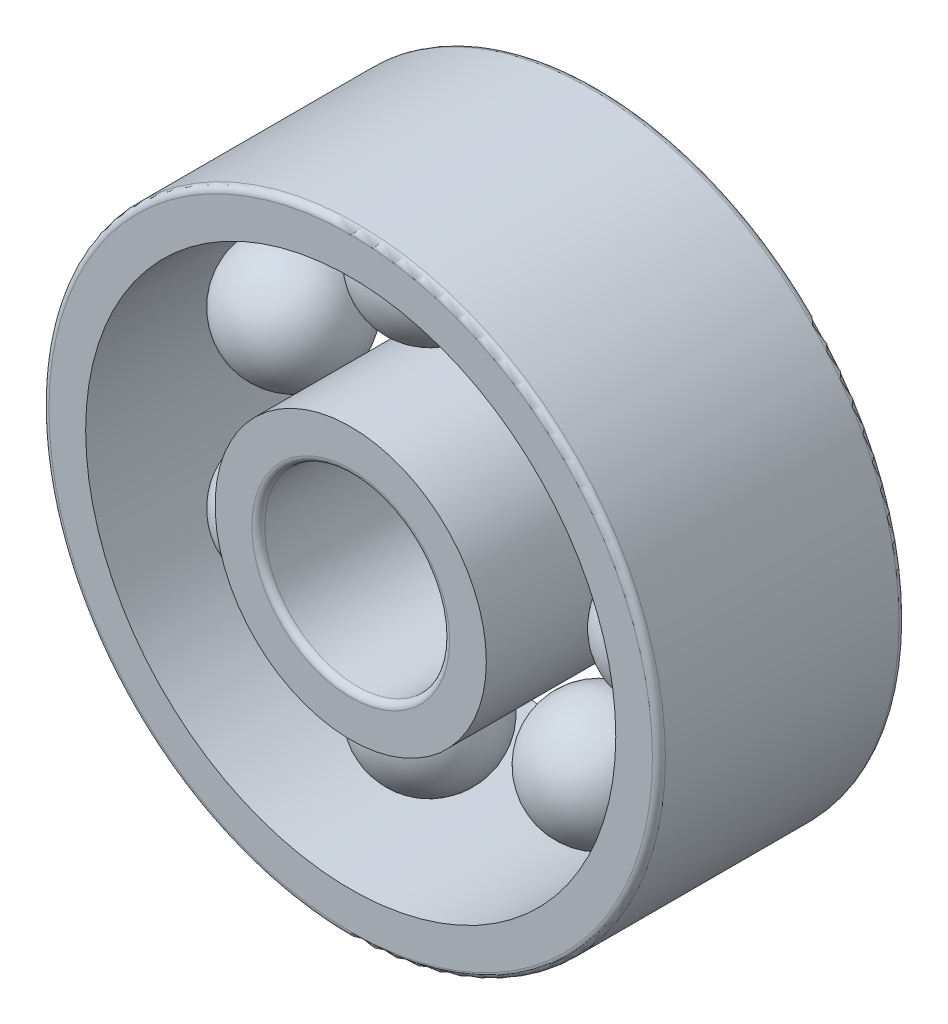
ISO-10303-21;
HEADER;
FILE_DESCRIPTION(('STEP AP214'),'2;1');
FILE_NAME('part.step','',(''),(''),'','','');
FILE_SCHEMA(('AUTOMOTIVE_DESIGN { 1 0 10303 214 1 1 1 1 }'));
ENDSEC;
DATA;
#1=APPLICATION_CONTEXT('core data for automotive mechanical design processes');
#2=APPLICATION_PROTOCOL_DEFINITION('international standard','automotive_design',2000,#1);
#3=PRODUCT_CONTEXT('',#1,'mechanical');
#4=PRODUCT('Part','Part','',(#3));
#5=PRODUCT_RELATED_PRODUCT_CATEGORY('part','',(#4));
#6=PRODUCT_DEFINITION_FORMATION('','',#4);
#7=PRODUCT_DEFINITION_CONTEXT('part definition',#1,'design');
#8=PRODUCT_DEFINITION('design','',#6,#7);
#9=PRODUCT_DEFINITION_SHAPE('','',#8);
#10=(LENGTH_UNIT() NAMED_UNIT(*) SI_UNIT(.MILLI.,.METRE.));
#11=(NAMED_UNIT(*) PLANE_ANGLE_UNIT() SI_UNIT($,.RADIAN.));
#12=(NAMED_UNIT(*) SI_UNIT($,.STERADIAN.) SOLID_ANGLE_UNIT());
#13=UNCERTAINTY_MEASURE_WITH_UNIT(LENGTH_MEASURE(1.E-05),#10,'distance_accuracy_value','');
#14=(GEOMETRIC_REPRESENTATION_CONTEXT(3) GLOBAL_UNCERTAINTY_ASSIGNED_CONTEXT((#13)) GLOBAL_UNIT_ASSIGNED_CONTEXT((#10,
#11,#12)) REPRESENTATION_CONTEXT('',''));
#15=CARTESIAN_POINT('',(0.,0.,0.));
#16=DIRECTION('',(0.,0.,1.));
#17=DIRECTION('',(1.,0.,0.));
#18=AXIS2_PLACEMENT_3D('',#15,#16,#17);
#19=CARTESIAN_POINT('',(2.02634185604088,-2.5409523180211,0.));
#20=DIRECTION('',(-0.623489801858733,0.78183148246803,0.));
#21=DIRECTION('',(0.,0.,-1.));
#22=AXIS2_PLACEMENT_3D('',#19,#20,#21);
#23=SPHERICAL_SURFACE('',#22,0.9975);
#24=CARTESIAN_POINT('',(1.4044107786868,-1.76107541425924,0.));
#25=VERTEX_POINT('',#24);
#26=VERTEX_LOOP('',#25);
#27=FACE_BOUND('',#26,.T.);
#28=ADVANCED_FACE('F38',(#27),#23,.T.);
#29=CLOSED_SHELL('',(#28));
#30=MANIFOLD_SOLID_BREP('B2',#29);
#31=CARTESIAN_POINT('',(-0.723193035358022,-3.16851571459093,0.));
#32=DIRECTION('',(0.222520933956315,0.974927912181824,0.));
#33=DIRECTION('',(0.,0.,-1.));
#34=AXIS2_PLACEMENT_3D('',#31,#32,#33);
#35=SPHERICAL_SURFACE('',#34,0.9975);
#36=CARTESIAN_POINT('',(-0.501228403736599,-2.19602512218956,0.));
#37=VERTEX_POINT('',#36);
#38=VERTEX_LOOP('',#37);
#39=FACE_BOUND('',#38,.T.);
#40=ADVANCED_FACE('F57',(#39),#35,.T.);
#41=CLOSED_SHELL('',(#40));
#42=MANIFOLD_SOLID_BREP('B6',#41);
#43=CARTESIAN_POINT('',(-2.92814882068286,-1.41012215213206,0.));
#44=DIRECTION('',(0.900968867902419,0.433883739117558,0.));
#45=DIRECTION('',(0.,0.,-1.));
#46=AXIS2_PLACEMENT_3D('',#43,#44,#45);
#47=SPHERICAL_SURFACE('',#46,0.9975);
#48=CARTESIAN_POINT('',(-2.0294323749502,-0.9773231223623,0.));
#49=VERTEX_POINT('',#48);
#50=VERTEX_LOOP('',#49);
#51=FACE_BOUND('',#50,.T.);
#52=ADVANCED_FACE('F76',(#51),#47,.T.);
#53=CLOSED_SHELL('',(#52));
#54=MANIFOLD_SOLID_BREP('B34',#53);
#55=CARTESIAN_POINT('',(-2.92814882068286,1.41012215213206,0.));
#56=DIRECTION('',(0.900968867902419,-0.433883739117558,0.));
#57=DIRECTION('',(0.,0.,-1.));
#58=AXIS2_PLACEMENT_3D('',#55,#56,#57);
#59=SPHERICAL_SURFACE('',#58,0.9975);
#60=CARTESIAN_POINT('',(-2.0294323749502,0.9773231223623,0.));
#61=VERTEX_POINT('',#60);
#62=VERTEX_LOOP('',#61);
#63=FACE_BOUND('',#62,.T.);
#64=ADVANCED_FACE('F95',(#63),#59,.T.);
#65=CLOSED_SHELL('',(#64));
#66=MANIFOLD_SOLID_BREP('B53',#65);
#67=CARTESIAN_POINT('',(-0.723193035358022,3.16851571459093,0.));
#68=DIRECTION('',(0.222520933956314,-0.974927912181824,0.));
#69=DIRECTION('',(0.,0.,-1.));
#70=AXIS2_PLACEMENT_3D('',#67,#68,#69);
#71=SPHERICAL_SURFACE('',#70,0.9975);
#72=CARTESIAN_POINT('',(-0.501228403736598,2.19602512218956,0.));
#73=VERTEX_POINT('',#72);
#74=VERTEX_LOOP('',#73);
#75=FACE_BOUND('',#74,.T.);
#76=ADVANCED_FACE('F114',(#75),#71,.T.);
#77=CLOSED_SHELL('',(#76));
#78=MANIFOLD_SOLID_BREP('B72',#77);
#79=CARTESIAN_POINT('',(2.02634185604088,2.5409523180211,0.));
#80=DIRECTION('',(-0.623489801858734,-0.78183148246803,0.));
#81=DIRECTION('',(0.,0.,-1.));
#82=AXIS2_PLACEMENT_3D('',#79,#80,#81);
#83=SPHERICAL_SURFACE('',#82,0.9975);
#84=CARTESIAN_POINT('',(1.4044107786868,1.76107541425924,0.));
#85=VERTEX_POINT('',#84);
#86=VERTEX_LOOP('',#85);
#87=FACE_BOUND('',#86,.T.);
#88=ADVANCED_FACE('F133',(#87),#83,.T.);
#89=CLOSED_SHELL('',(#88));
#90=MANIFOLD_SOLID_BREP('B91',#89);
#91=CARTESIAN_POINT('',(3.25,0.,0.));
#92=DIRECTION('',(-1.,0.,0.));
#93=DIRECTION('',(0.,0.,-1.));
#94=AXIS2_PLACEMENT_3D('',#91,#92,#93);
#95=SPHERICAL_SURFACE('',#94,0.9975);
#96=CARTESIAN_POINT('',(2.2525,0.,0.));
#97=VERTEX_POINT('',#96);
#98=VERTEX_LOOP('',#97);
#99=FACE_BOUND('',#98,.T.);
#100=ADVANCED_FACE('F154',(#99),#95,.T.);
#101=CLOSED_SHELL('',(#100));
#102=MANIFOLD_SOLID_BREP('B110',#101);
#103=CARTESIAN_POINT('',(0.,0.,4.));
#104=DIRECTION('',(0.,0.,1.));
#105=DIRECTION('',(1.,0.,0.));
#106=AXIS2_PLACEMENT_3D('',#103,#104,#105);
#107=CYLINDRICAL_SURFACE('',#106,4.3);
#108=CARTESIAN_POINT('',(0.,0.,2.));
#109=DIRECTION('',(0.,0.,1.));
#110=DIRECTION('',(1.,0.,0.));
#111=AXIS2_PLACEMENT_3D('',#108,#109,#110);
#112=CIRCLE('',#111,4.3);
#113=CARTESIAN_POINT('',(4.3,0.,2.));
#114=VERTEX_POINT('',#113);
#115=EDGE_CURVE('E194',#114,#114,#112,.T.);
#116=ORIENTED_EDGE('',*,*,#115,.T.);
#117=EDGE_LOOP('',(#116));
#118=FACE_BOUND('',#117,.T.);
#119=CARTESIAN_POINT('',(0.,0.,-2.));
#120=DIRECTION('',(0.,0.,1.));
#121=DIRECTION('',(1.,0.,0.));
#122=AXIS2_PLACEMENT_3D('',#119,#120,#121);
#123=CIRCLE('',#122,4.3);
#124=CARTESIAN_POINT('',(4.3,0.,-2.));
#125=VERTEX_POINT('',#124);
#126=EDGE_CURVE('E197',#125,#125,#123,.T.);
#127=ORIENTED_EDGE('',*,*,#126,.F.);
#128=EDGE_LOOP('',(#127));
#129=FACE_BOUND('',#128,.T.);
#130=ADVANCED_FACE('F174',(#118,#129),#107,.F.);
#131=CARTESIAN_POINT('',(4.3,0.,2.));
#132=DIRECTION('',(0.,0.,1.));
#133=DIRECTION('',(1.,0.,0.));
#134=AXIS2_PLACEMENT_3D('',#131,#132,#133);
#135=PLANE('',#134);
#136=CARTESIAN_POINT('',(0.,0.,2.));
#137=DIRECTION('',(0.,0.,1.));
#138=DIRECTION('',(1.,0.,0.));
#139=AXIS2_PLACEMENT_3D('',#136,#137,#138);
#140=CIRCLE('',#139,4.895);
#141=CARTESIAN_POINT('',(4.895,0.,2.));
#142=VERTEX_POINT('',#141);
#143=EDGE_CURVE('E153',#142,#142,#140,.T.);
#144=ORIENTED_EDGE('',*,*,#143,.T.);
#145=EDGE_LOOP('',(#144));
#146=FACE_BOUND('',#145,.T.);
#147=ORIENTED_EDGE('',*,*,#115,.F.);
#148=EDGE_LOOP('',(#147));
#149=FACE_BOUND('',#148,.T.);
#150=ADVANCED_FACE('F204',(#146,#149),#135,.T.);
#151=CARTESIAN_POINT('',(0.,0.,4.));
#152=DIRECTION('',(0.,0.,1.));
#153=DIRECTION('',(1.,0.,0.));
#154=AXIS2_PLACEMENT_3D('',#151,#152,#153);
#155=CYLINDRICAL_SURFACE('',#154,5.);
#156=CARTESIAN_POINT('',(0.,0.,-1.895));
#157=DIRECTION('',(0.,0.,-1.));
#158=DIRECTION('',(-1.,0.,0.));
#159=AXIS2_PLACEMENT_3D('',#156,#157,#158);
#160=CIRCLE('',#159,5.);
#161=CARTESIAN_POINT('',(-5.,0.,-1.895));
#162=VERTEX_POINT('',#161);
#163=EDGE_CURVE('E185',#162,#162,#160,.F.);
#164=ORIENTED_EDGE('',*,*,#163,.T.);
#165=EDGE_LOOP('',(#164));
#166=FACE_BOUND('',#165,.T.);
#167=CARTESIAN_POINT('',(0.,0.,1.895));
#168=DIRECTION('',(0.,0.,1.));
#169=DIRECTION('',(1.,0.,0.));
#170=AXIS2_PLACEMENT_3D('',#167,#168,#169);
#171=CIRCLE('',#170,5.);
#172=CARTESIAN_POINT('',(5.,0.,1.895));
#173=VERTEX_POINT('',#172);
#174=EDGE_CURVE('E189',#173,#173,#171,.F.);
#175=ORIENTED_EDGE('',*,*,#174,.T.);
#176=EDGE_LOOP('',(#175));
#177=FACE_BOUND('',#176,.T.);
#178=ADVANCED_FACE('F210',(#166,#177),#155,.T.);
#179=CARTESIAN_POINT('',(5.,0.,-2.));
#180=DIRECTION('',(0.,0.,-1.));
#181=DIRECTION('',(-1.,0.,0.));
#182=AXIS2_PLACEMENT_3D('',#179,#180,#181);
#183=PLANE('',#182);
#184=CARTESIAN_POINT('',(0.,0.,-2.));
#185=DIRECTION('',(0.,0.,-1.));
#186=DIRECTION('',(-1.,0.,0.));
#187=AXIS2_PLACEMENT_3D('',#184,#185,#186);
#188=CIRCLE('',#187,4.895);
#189=CARTESIAN_POINT('',(-4.895,0.,-2.));
#190=VERTEX_POINT('',#189);
#191=EDGE_CURVE('E181',#190,#190,#188,.T.);
#192=ORIENTED_EDGE('',*,*,#191,.T.);
#193=EDGE_LOOP('',(#192));
#194=FACE_BOUND('',#193,.T.);
#195=ORIENTED_EDGE('',*,*,#126,.T.);
#196=EDGE_LOOP('',(#195));
#197=FACE_BOUND('',#196,.T.);
#198=ADVANCED_FACE('F201',(#194,#197),#183,.T.);
#199=CARTESIAN_POINT('',(0.,0.,-1.895));
#200=DIRECTION('',(0.,0.,-1.));
#201=DIRECTION('',(-1.,0.,0.));
#202=AXIS2_PLACEMENT_3D('',#199,#200,#201);
#203=TOROIDAL_SURFACE('',#202,4.895,0.105);
#204=ORIENTED_EDGE('',*,*,#191,.F.);
#205=EDGE_LOOP('',(#204));
#206=FACE_BOUND('',#205,.T.);
#207=ORIENTED_EDGE('',*,*,#163,.F.);
#208=EDGE_LOOP('',(#207));
#209=FACE_BOUND('',#208,.T.);
#210=ADVANCED_FACE('F213',(#206,#209),#203,.T.);
#211=CARTESIAN_POINT('',(0.,0.,1.895));
#212=DIRECTION('',(0.,0.,1.));
#213=DIRECTION('',(1.,0.,0.));
#214=AXIS2_PLACEMENT_3D('',#211,#212,#213);
#215=TOROIDAL_SURFACE('',#214,4.895,0.105);
#216=ORIENTED_EDGE('',*,*,#174,.F.);
#217=EDGE_LOOP('',(#216));
#218=FACE_BOUND('',#217,.T.);
#219=ORIENTED_EDGE('',*,*,#143,.F.);
#220=EDGE_LOOP('',(#219));
#221=FACE_BOUND('',#220,.T.);
#222=ADVANCED_FACE('F176',(#218,#221),#215,.T.);
#223=CLOSED_SHELL('',(#130,#150,#178,#198,#210,#222));
#224=MANIFOLD_SOLID_BREP('B129',#223);
#225=CARTESIAN_POINT('',(0.,0.,4.));
#226=DIRECTION('',(0.,0.,1.));
#227=DIRECTION('',(1.,0.,0.));
#228=AXIS2_PLACEMENT_3D('',#225,#226,#227);
#229=CYLINDRICAL_SURFACE('',#228,1.5);
#230=CARTESIAN_POINT('',(0.,0.,-1.895));
#231=DIRECTION('',(0.,0.,-1.));
#232=DIRECTION('',(-1.,0.,0.));
#233=AXIS2_PLACEMENT_3D('',#230,#231,#232);
#234=CIRCLE('',#233,1.5);
#235=CARTESIAN_POINT('',(-1.5,0.,-1.895));
#236=VERTEX_POINT('',#235);
#237=EDGE_CURVE('E273',#236,#236,#234,.T.);
#238=ORIENTED_EDGE('',*,*,#237,.T.);
#239=EDGE_LOOP('',(#238));
#240=FACE_BOUND('',#239,.T.);
#241=CARTESIAN_POINT('',(0.,0.,1.895));
#242=DIRECTION('',(0.,0.,1.));
#243=DIRECTION('',(1.,0.,0.));
#244=AXIS2_PLACEMENT_3D('',#241,#242,#243);
#245=CIRCLE('',#244,1.5);
#246=CARTESIAN_POINT('',(1.5,0.,1.895));
#247=VERTEX_POINT('',#246);
#248=EDGE_CURVE('E277',#247,#247,#245,.T.);
#249=ORIENTED_EDGE('',*,*,#248,.T.);
#250=EDGE_LOOP('',(#249));
#251=FACE_BOUND('',#250,.T.);
#252=ADVANCED_FACE('F266',(#240,#251),#229,.F.);
#253=CARTESIAN_POINT('',(1.5,0.,2.));
#254=DIRECTION('',(0.,0.,1.));
#255=DIRECTION('',(1.,0.,0.));
#256=AXIS2_PLACEMENT_3D('',#253,#254,#255);
#257=PLANE('',#256);
#258=CARTESIAN_POINT('',(0.,0.,2.));
#259=DIRECTION('',(0.,0.,1.));
#260=DIRECTION('',(1.,0.,0.));
#261=AXIS2_PLACEMENT_3D('',#258,#259,#260);
#262=CIRCLE('',#261,1.605);
#263=CARTESIAN_POINT('',(1.605,0.,2.));
#264=VERTEX_POINT('',#263);
#265=EDGE_CURVE('E173',#264,#264,#262,.F.);
#266=ORIENTED_EDGE('',*,*,#265,.T.);
#267=EDGE_LOOP('',(#266));
#268=FACE_BOUND('',#267,.T.);
#269=CARTESIAN_POINT('',(0.,0.,2.));
#270=DIRECTION('',(0.,0.,1.));
#271=DIRECTION('',(1.,0.,0.));
#272=AXIS2_PLACEMENT_3D('',#269,#270,#271);
#273=CIRCLE('',#272,2.2);
#274=CARTESIAN_POINT('',(2.2,0.,2.));
#275=VERTEX_POINT('',#274);
#276=EDGE_CURVE('E286',#275,#275,#273,.T.);
#277=ORIENTED_EDGE('',*,*,#276,.T.);
#278=EDGE_LOOP('',(#277));
#279=FACE_BOUND('',#278,.T.);
#280=ADVANCED_FACE('F306',(#268,#279),#257,.T.);
#281=CARTESIAN_POINT('',(0.,0.,4.));
#282=DIRECTION('',(0.,0.,1.));
#283=DIRECTION('',(1.,0.,0.));
#284=AXIS2_PLACEMENT_3D('',#281,#282,#283);
#285=CYLINDRICAL_SURFACE('',#284,2.2);
#286=CARTESIAN_POINT('',(0.,0.,-2.));
#287=DIRECTION('',(0.,0.,1.));
#288=DIRECTION('',(1.,0.,0.));
#289=AXIS2_PLACEMENT_3D('',#286,#287,#288);
#290=CIRCLE('',#289,2.2);
#291=CARTESIAN_POINT('',(2.2,0.,-2.));
#292=VERTEX_POINT('',#291);
#293=EDGE_CURVE('E289',#292,#292,#290,.T.);
#294=ORIENTED_EDGE('',*,*,#293,.T.);
#295=EDGE_LOOP('',(#294));
#296=FACE_BOUND('',#295,.T.);
#297=ORIENTED_EDGE('',*,*,#276,.F.);
#298=EDGE_LOOP('',(#297));
#299=FACE_BOUND('',#298,.T.);
#300=ADVANCED_FACE('F293',(#296,#299),#285,.T.);
#301=CARTESIAN_POINT('',(2.2,0.,-2.));
#302=DIRECTION('',(0.,0.,-1.));
#303=DIRECTION('',(-1.,0.,0.));
#304=AXIS2_PLACEMENT_3D('',#301,#302,#303);
#305=PLANE('',#304);
#306=CARTESIAN_POINT('',(0.,0.,-2.));
#307=DIRECTION('',(0.,0.,-1.));
#308=DIRECTION('',(-1.,0.,0.));
#309=AXIS2_PLACEMENT_3D('',#306,#307,#308);
#310=CIRCLE('',#309,1.605);
#311=CARTESIAN_POINT('',(-1.605,0.,-2.));
#312=VERTEX_POINT('',#311);
#313=EDGE_CURVE('E281',#312,#312,#310,.F.);
#314=ORIENTED_EDGE('',*,*,#313,.T.);
#315=EDGE_LOOP('',(#314));
#316=FACE_BOUND('',#315,.T.);
#317=ORIENTED_EDGE('',*,*,#293,.F.);
#318=EDGE_LOOP('',(#317));
#319=FACE_BOUND('',#318,.T.);
#320=ADVANCED_FACE('F296',(#316,#319),#305,.T.);
#321=CARTESIAN_POINT('',(0.,0.,-1.895));
#322=DIRECTION('',(0.,0.,-1.));
#323=DIRECTION('',(-1.,0.,0.));
#324=AXIS2_PLACEMENT_3D('',#321,#322,#323);
#325=TOROIDAL_SURFACE('',#324,1.605,0.105);
#326=ORIENTED_EDGE('',*,*,#237,.F.);
#327=EDGE_LOOP('',(#326));
#328=FACE_BOUND('',#327,.T.);
#329=ORIENTED_EDGE('',*,*,#313,.F.);
#330=EDGE_LOOP('',(#329));
#331=FACE_BOUND('',#330,.T.);
#332=ADVANCED_FACE('F298',(#328,#331),#325,.T.);
#333=CARTESIAN_POINT('',(0.,0.,1.895));
#334=DIRECTION('',(0.,0.,1.));
#335=DIRECTION('',(1.,0.,0.));
#336=AXIS2_PLACEMENT_3D('',#333,#334,#335);
#337=TOROIDAL_SURFACE('',#336,1.605,0.105);
#338=ORIENTED_EDGE('',*,*,#265,.F.);
#339=EDGE_LOOP('',(#338));
#340=FACE_BOUND('',#339,.T.);
#341=ORIENTED_EDGE('',*,*,#248,.F.);
#342=EDGE_LOOP('',(#341));
#343=FACE_BOUND('',#342,.T.);
#344=ADVANCED_FACE('F268',(#340,#343),#337,.T.);
#345=CLOSED_SHELL('',(#252,#280,#300,#320,#332,#344));
#346=MANIFOLD_SOLID_BREP('B148',#345);
#347=ADVANCED_BREP_SHAPE_REPRESENTATION('',(#18,#30,#42,#54,#66,#78,#90,#102,#224,#346),#14);
#348=SHAPE_DEFINITION_REPRESENTATION(#9,#347);
ENDSEC;
END-ISO-10303-21;
